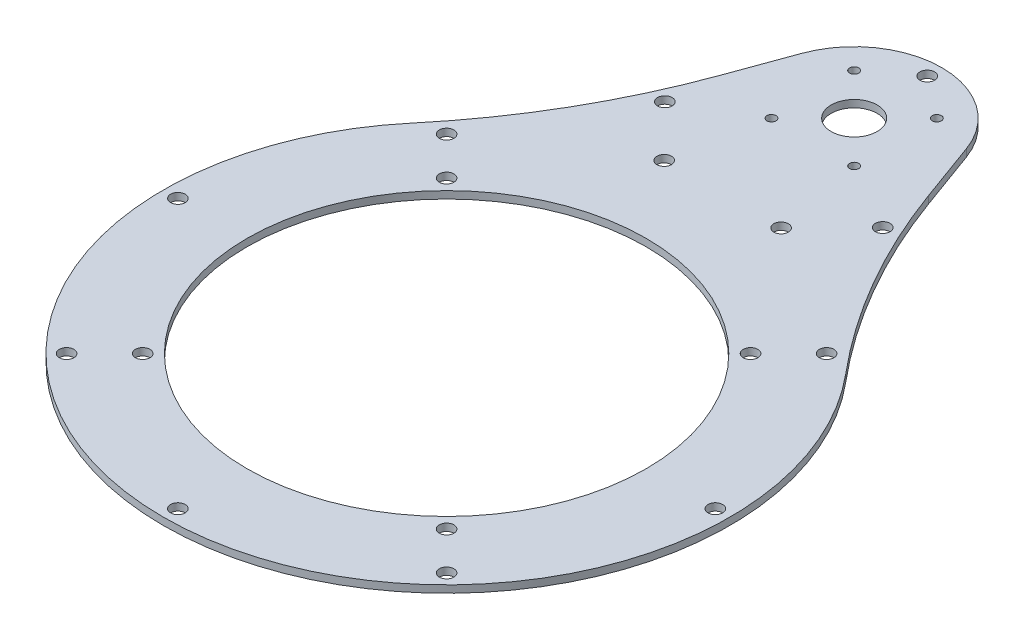
ISO-10303-21;
HEADER;
FILE_DESCRIPTION(('STEP AP214'),'2;1');
FILE_NAME('part.step','',(''),(''),'','','');
FILE_SCHEMA(('AUTOMOTIVE_DESIGN { 1 0 10303 214 1 1 1 1 }'));
ENDSEC;
DATA;
#1=APPLICATION_CONTEXT('core data for automotive mechanical design processes');
#2=APPLICATION_PROTOCOL_DEFINITION('international standard','automotive_design',2000,#1);
#3=PRODUCT_CONTEXT('',#1,'mechanical');
#4=PRODUCT('Part','Part','',(#3));
#5=PRODUCT_RELATED_PRODUCT_CATEGORY('part','',(#4));
#6=PRODUCT_DEFINITION_FORMATION('','',#4);
#7=PRODUCT_DEFINITION_CONTEXT('part definition',#1,'design');
#8=PRODUCT_DEFINITION('design','',#6,#7);
#9=PRODUCT_DEFINITION_SHAPE('','',#8);
#10=(LENGTH_UNIT() NAMED_UNIT(*) SI_UNIT(.MILLI.,.METRE.));
#11=(NAMED_UNIT(*) PLANE_ANGLE_UNIT() SI_UNIT($,.RADIAN.));
#12=(NAMED_UNIT(*) SI_UNIT($,.STERADIAN.) SOLID_ANGLE_UNIT());
#13=UNCERTAINTY_MEASURE_WITH_UNIT(LENGTH_MEASURE(1.E-05),#10,'distance_accuracy_value','');
#14=(GEOMETRIC_REPRESENTATION_CONTEXT(3) GLOBAL_UNCERTAINTY_ASSIGNED_CONTEXT((#13)) GLOBAL_UNIT_ASSIGNED_CONTEXT((#10,
#11,#12)) REPRESENTATION_CONTEXT('',''));
#15=CARTESIAN_POINT('',(0.,0.,0.));
#16=DIRECTION('',(0.,0.,1.));
#17=DIRECTION('',(1.,0.,0.));
#18=AXIS2_PLACEMENT_3D('',#15,#16,#17);
#19=CARTESIAN_POINT('',(310.404168796494,-67.975,-260.460023553028));
#20=DIRECTION('',(0.,1.,0.));
#21=DIRECTION('',(0.,0.,1.));
#22=AXIS2_PLACEMENT_3D('',#19,#20,#21);
#23=CYLINDRICAL_SURFACE('',#22,282.10386458607);
#24=CARTESIAN_POINT('',(310.404168796494,-64.8,-260.460023553028));
#25=DIRECTION('',(0.,-1.,0.));
#26=DIRECTION('',(0.,0.,-1.));
#27=AXIS2_PLACEMENT_3D('',#24,#25,#26);
#28=CIRCLE('',#27,282.10386458607);
#29=CARTESIAN_POINT('',(45.3132489497764,-64.8,-163.974819354577));
#30=VERTEX_POINT('',#29);
#31=CARTESIAN_POINT('',(94.3000709479463,-64.8,-79.1271547524128));
#32=VERTEX_POINT('',#31);
#33=EDGE_CURVE('E187',#30,#32,#28,.F.);
#34=ORIENTED_EDGE('',*,*,#33,.T.);
#35=DIRECTION('',(0.,1.,0.));
#36=VECTOR('',#35,1.);
#37=CARTESIAN_POINT('',(94.3000709479463,-67.975,-79.1271547524128));
#38=LINE('',#37,#36);
#39=CARTESIAN_POINT('',(94.3000709479463,-67.975,-79.1271547524128));
#40=VERTEX_POINT('',#39);
#41=EDGE_CURVE('E11',#40,#32,#38,.T.);
#42=ORIENTED_EDGE('',*,*,#41,.F.);
#43=CARTESIAN_POINT('',(310.404168796494,-67.975,-260.460023553028));
#44=DIRECTION('',(0.,-1.,0.));
#45=DIRECTION('',(0.,0.,-1.));
#46=AXIS2_PLACEMENT_3D('',#43,#44,#45);
#47=CIRCLE('',#46,282.10386458607);
#48=CARTESIAN_POINT('',(45.3132489497764,-67.975,-163.974819354577));
#49=VERTEX_POINT('',#48);
#50=EDGE_CURVE('E261',#49,#40,#47,.F.);
#51=ORIENTED_EDGE('',*,*,#50,.F.);
#52=DIRECTION('',(0.,1.,0.));
#53=VECTOR('',#52,1.);
#54=CARTESIAN_POINT('',(45.3132489497764,-67.975,-163.974819354577));
#55=LINE('',#54,#53);
#56=EDGE_CURVE('E168',#49,#30,#55,.T.);
#57=ORIENTED_EDGE('',*,*,#56,.T.);
#58=EDGE_LOOP('',(#34,#42,#51,#57));
#59=FACE_BOUND('',#58,.T.);
#60=ADVANCED_FACE('F35',(#59),#23,.F.);
#61=CARTESIAN_POINT('',(0.,-67.975,0.));
#62=DIRECTION('',(0.,1.,0.));
#63=DIRECTION('',(0.,0.,1.));
#64=AXIS2_PLACEMENT_3D('',#61,#62,#63);
#65=CYLINDRICAL_SURFACE('',#64,123.1);
#66=CARTESIAN_POINT('',(0.,-64.8,0.));
#67=DIRECTION('',(0.,-1.,0.));
#68=DIRECTION('',(0.,0.,-1.));
#69=AXIS2_PLACEMENT_3D('',#66,#67,#68);
#70=CIRCLE('',#69,123.1);
#71=CARTESIAN_POINT('',(-94.3000709479463,-64.8,-79.1271547524128));
#72=VERTEX_POINT('',#71);
#73=EDGE_CURVE('E190',#32,#72,#70,.T.);
#74=ORIENTED_EDGE('',*,*,#73,.T.);
#75=DIRECTION('',(0.,1.,0.));
#76=VECTOR('',#75,1.);
#77=CARTESIAN_POINT('',(-94.3000709479463,-67.975,-79.1271547524128));
#78=LINE('',#77,#76);
#79=CARTESIAN_POINT('',(-94.3000709479463,-67.975,-79.1271547524128));
#80=VERTEX_POINT('',#79);
#81=EDGE_CURVE('E44',#80,#72,#78,.T.);
#82=ORIENTED_EDGE('',*,*,#81,.F.);
#83=CARTESIAN_POINT('',(0.,-67.975,0.));
#84=DIRECTION('',(0.,-1.,0.));
#85=DIRECTION('',(0.,0.,-1.));
#86=AXIS2_PLACEMENT_3D('',#83,#84,#85);
#87=CIRCLE('',#86,123.1);
#88=EDGE_CURVE('E88',#40,#80,#87,.T.);
#89=ORIENTED_EDGE('',*,*,#88,.F.);
#90=ORIENTED_EDGE('',*,*,#41,.T.);
#91=EDGE_LOOP('',(#74,#82,#89,#90));
#92=FACE_BOUND('',#91,.T.);
#93=ADVANCED_FACE('F253',(#92),#65,.T.);
#94=CARTESIAN_POINT('',(-310.404168796494,-67.975,-260.460023553028));
#95=DIRECTION('',(0.,1.,0.));
#96=DIRECTION('',(0.,0.,1.));
#97=AXIS2_PLACEMENT_3D('',#94,#95,#96);
#98=CYLINDRICAL_SURFACE('',#97,282.10386458607);
#99=CARTESIAN_POINT('',(-310.404168796494,-64.8,-260.460023553028));
#100=DIRECTION('',(0.,-1.,0.));
#101=DIRECTION('',(0.,0.,-1.));
#102=AXIS2_PLACEMENT_3D('',#99,#100,#101);
#103=CIRCLE('',#102,282.10386458607);
#104=CARTESIAN_POINT('',(-45.3132489497764,-64.8,-163.974819354577));
#105=VERTEX_POINT('',#104);
#106=EDGE_CURVE('E193',#105,#72,#103,.T.);
#107=ORIENTED_EDGE('',*,*,#106,.F.);
#108=DIRECTION('',(0.,1.,0.));
#109=VECTOR('',#108,1.);
#110=CARTESIAN_POINT('',(-45.3132489497764,-67.975,-163.974819354577));
#111=LINE('',#110,#109);
#112=CARTESIAN_POINT('',(-45.3132489497764,-67.975,-163.974819354577));
#113=VERTEX_POINT('',#112);
#114=EDGE_CURVE('E104',#113,#105,#111,.T.);
#115=ORIENTED_EDGE('',*,*,#114,.F.);
#116=CARTESIAN_POINT('',(-310.404168796494,-67.975,-260.460023553028));
#117=DIRECTION('',(0.,-1.,0.));
#118=DIRECTION('',(0.,0.,-1.));
#119=AXIS2_PLACEMENT_3D('',#116,#117,#118);
#120=CIRCLE('',#119,282.10386458607);
#121=EDGE_CURVE('E114',#113,#80,#120,.T.);
#122=ORIENTED_EDGE('',*,*,#121,.T.);
#123=ORIENTED_EDGE('',*,*,#81,.T.);
#124=EDGE_LOOP('',(#107,#115,#122,#123));
#125=FACE_BOUND('',#124,.T.);
#126=ADVANCED_FACE('F252',(#125),#98,.F.);
#127=CARTESIAN_POINT('',(-92.713096844564,-67.975,-33.7448075780601));
#128=DIRECTION('',(-0.939692620785911,0.,-0.34202014332566));
#129=DIRECTION('',(-0.34202014332566,0.,0.939692620785912));
#130=AXIS2_PLACEMENT_3D('',#127,#128,#129);
#131=PLANE('',#130);
#132=DIRECTION('',(-0.34202014332566,0.,0.939692620785912));
#133=VECTOR('',#132,1.);
#134=CARTESIAN_POINT('',(-92.713096844564,-64.8,-33.7448075780601));
#135=LINE('',#134,#133);
#136=CARTESIAN_POINT('',(-35.8022888519432,-64.8,-190.105967460708));
#137=VERTEX_POINT('',#136);
#138=EDGE_CURVE('E103',#137,#105,#135,.T.);
#139=ORIENTED_EDGE('',*,*,#138,.F.);
#140=DIRECTION('',(0.,1.,0.));
#141=VECTOR('',#140,1.);
#142=CARTESIAN_POINT('',(-35.8022888519432,-67.975,-190.105967460708));
#143=LINE('',#142,#141);
#144=CARTESIAN_POINT('',(-35.8022888519432,-67.975,-190.105967460708));
#145=VERTEX_POINT('',#144);
#146=EDGE_CURVE('E97',#145,#137,#143,.T.);
#147=ORIENTED_EDGE('',*,*,#146,.F.);
#148=DIRECTION('',(-0.34202014332566,0.,0.939692620785912));
#149=VECTOR('',#148,1.);
#150=CARTESIAN_POINT('',(-92.713096844564,-67.975,-33.7448075780601));
#151=LINE('',#150,#149);
#152=EDGE_CURVE('E101',#145,#113,#151,.T.);
#153=ORIENTED_EDGE('',*,*,#152,.T.);
#154=ORIENTED_EDGE('',*,*,#114,.T.);
#155=EDGE_LOOP('',(#139,#147,#153,#154));
#156=FACE_BOUND('',#155,.T.);
#157=ADVANCED_FACE('F99',(#156),#131,.T.);
#158=CARTESIAN_POINT('',(0.,-67.975,-177.075));
#159=DIRECTION('',(0.,1.,0.));
#160=DIRECTION('',(0.,0.,1.));
#161=AXIS2_PLACEMENT_3D('',#158,#159,#160);
#162=CYLINDRICAL_SURFACE('',#161,38.1);
#163=CARTESIAN_POINT('',(0.,-64.8,-177.075));
#164=DIRECTION('',(0.,-1.,0.));
#165=DIRECTION('',(0.,0.,-1.));
#166=AXIS2_PLACEMENT_3D('',#163,#164,#165);
#167=CIRCLE('',#166,38.1);
#168=CARTESIAN_POINT('',(35.8022888519432,-64.8,-190.105967460708));
#169=VERTEX_POINT('',#168);
#170=EDGE_CURVE('E74',#137,#169,#167,.T.);
#171=ORIENTED_EDGE('',*,*,#170,.T.);
#172=DIRECTION('',(0.,1.,0.));
#173=VECTOR('',#172,1.);
#174=CARTESIAN_POINT('',(35.8022888519432,-67.975,-190.105967460708));
#175=LINE('',#174,#173);
#176=CARTESIAN_POINT('',(35.8022888519432,-67.975,-190.105967460708));
#177=VERTEX_POINT('',#176);
#178=EDGE_CURVE('E105',#177,#169,#175,.T.);
#179=ORIENTED_EDGE('',*,*,#178,.F.);
#180=CARTESIAN_POINT('',(0.,-67.975,-177.075));
#181=DIRECTION('',(0.,-1.,0.));
#182=DIRECTION('',(0.,0.,-1.));
#183=AXIS2_PLACEMENT_3D('',#180,#181,#182);
#184=CIRCLE('',#183,38.1);
#185=EDGE_CURVE('E107',#145,#177,#184,.T.);
#186=ORIENTED_EDGE('',*,*,#185,.F.);
#187=ORIENTED_EDGE('',*,*,#146,.T.);
#188=EDGE_LOOP('',(#171,#179,#186,#187));
#189=FACE_BOUND('',#188,.T.);
#190=ADVANCED_FACE('F108',(#189),#162,.T.);
#191=CARTESIAN_POINT('',(0.,-67.975,0.));
#192=DIRECTION('',(0.,1.,0.));
#193=DIRECTION('',(0.,0.,1.));
#194=AXIS2_PLACEMENT_3D('',#191,#192,#193);
#195=CYLINDRICAL_SURFACE('',#194,86.7075);
#196=CARTESIAN_POINT('',(0.,-67.975,0.));
#197=DIRECTION('',(0.,-1.,0.));
#198=DIRECTION('',(0.,0.,-1.));
#199=AXIS2_PLACEMENT_3D('',#196,#197,#198);
#200=CIRCLE('',#199,86.7075);
#201=CARTESIAN_POINT('',(0.,-67.975,-86.7075));
#202=VERTEX_POINT('',#201);
#203=EDGE_CURVE('E162',#202,#202,#200,.F.);
#204=ORIENTED_EDGE('',*,*,#203,.F.);
#205=EDGE_LOOP('',(#204));
#206=FACE_BOUND('',#205,.T.);
#207=CARTESIAN_POINT('',(0.,-64.8,0.));
#208=DIRECTION('',(0.,-1.,0.));
#209=DIRECTION('',(0.,0.,-1.));
#210=AXIS2_PLACEMENT_3D('',#207,#208,#209);
#211=CIRCLE('',#210,86.7075);
#212=CARTESIAN_POINT('',(0.,-64.8,-86.7075));
#213=VERTEX_POINT('',#212);
#214=EDGE_CURVE('E241',#213,#213,#211,.F.);
#215=ORIENTED_EDGE('',*,*,#214,.T.);
#216=EDGE_LOOP('',(#215));
#217=FACE_BOUND('',#216,.T.);
#218=ADVANCED_FACE('F335',(#206,#217),#195,.F.);
#219=CARTESIAN_POINT('',(66.0260956932935,-67.975,-66.0260956932942));
#220=DIRECTION('',(0.,1.,0.));
#221=DIRECTION('',(0.,0.,1.));
#222=AXIS2_PLACEMENT_3D('',#219,#220,#221);
#223=CYLINDRICAL_SURFACE('',#222,3.175);
#224=CARTESIAN_POINT('',(66.0260956932935,-67.975,-66.0260956932942));
#225=DIRECTION('',(0.,-1.,0.));
#226=DIRECTION('',(0.,0.,-1.));
#227=AXIS2_PLACEMENT_3D('',#224,#225,#226);
#228=CIRCLE('',#227,3.175);
#229=CARTESIAN_POINT('',(66.0260956932935,-67.975,-69.2010956932942));
#230=VERTEX_POINT('',#229);
#231=EDGE_CURVE('E159',#230,#230,#228,.F.);
#232=ORIENTED_EDGE('',*,*,#231,.F.);
#233=EDGE_LOOP('',(#232));
#234=FACE_BOUND('',#233,.T.);
#235=CARTESIAN_POINT('',(66.0260956932935,-64.8,-66.0260956932942));
#236=DIRECTION('',(0.,-1.,0.));
#237=DIRECTION('',(0.,0.,-1.));
#238=AXIS2_PLACEMENT_3D('',#235,#236,#237);
#239=CIRCLE('',#238,3.175);
#240=CARTESIAN_POINT('',(66.0260956932935,-64.8,-69.2010956932942));
#241=VERTEX_POINT('',#240);
#242=EDGE_CURVE('E238',#241,#241,#239,.F.);
#243=ORIENTED_EDGE('',*,*,#242,.T.);
#244=EDGE_LOOP('',(#243));
#245=FACE_BOUND('',#244,.T.);
#246=ADVANCED_FACE('F338',(#234,#245),#223,.F.);
#247=CARTESIAN_POINT('',(-66.0260956932935,-67.975,66.0260956932942));
#248=DIRECTION('',(0.,1.,0.));
#249=DIRECTION('',(0.,0.,1.));
#250=AXIS2_PLACEMENT_3D('',#247,#248,#249);
#251=CYLINDRICAL_SURFACE('',#250,3.175);
#252=CARTESIAN_POINT('',(-66.0260956932935,-67.975,66.0260956932942));
#253=DIRECTION('',(0.,-1.,0.));
#254=DIRECTION('',(0.,0.,-1.));
#255=AXIS2_PLACEMENT_3D('',#252,#253,#254);
#256=CIRCLE('',#255,3.175);
#257=CARTESIAN_POINT('',(-66.0260956932935,-67.975,62.8510956932942));
#258=VERTEX_POINT('',#257);
#259=EDGE_CURVE('E156',#258,#258,#256,.F.);
#260=ORIENTED_EDGE('',*,*,#259,.F.);
#261=EDGE_LOOP('',(#260));
#262=FACE_BOUND('',#261,.T.);
#263=CARTESIAN_POINT('',(-66.0260956932935,-64.8,66.0260956932942));
#264=DIRECTION('',(0.,-1.,0.));
#265=DIRECTION('',(0.,0.,-1.));
#266=AXIS2_PLACEMENT_3D('',#263,#264,#265);
#267=CIRCLE('',#266,3.175);
#268=CARTESIAN_POINT('',(-66.0260956932935,-64.8,62.8510956932942));
#269=VERTEX_POINT('',#268);
#270=EDGE_CURVE('E235',#269,#269,#267,.F.);
#271=ORIENTED_EDGE('',*,*,#270,.T.);
#272=EDGE_LOOP('',(#271));
#273=FACE_BOUND('',#272,.T.);
#274=ADVANCED_FACE('F342',(#262,#273),#251,.F.);
#275=CARTESIAN_POINT('',(66.0260956932942,-67.975,66.0260956932935));
#276=DIRECTION('',(0.,1.,0.));
#277=DIRECTION('',(0.,0.,1.));
#278=AXIS2_PLACEMENT_3D('',#275,#276,#277);
#279=CYLINDRICAL_SURFACE('',#278,3.175);
#280=CARTESIAN_POINT('',(66.0260956932942,-67.975,66.0260956932935));
#281=DIRECTION('',(0.,-1.,0.));
#282=DIRECTION('',(0.,0.,-1.));
#283=AXIS2_PLACEMENT_3D('',#280,#281,#282);
#284=CIRCLE('',#283,3.175);
#285=CARTESIAN_POINT('',(66.0260956932942,-67.975,62.8510956932935));
#286=VERTEX_POINT('',#285);
#287=EDGE_CURVE('E153',#286,#286,#284,.F.);
#288=ORIENTED_EDGE('',*,*,#287,.F.);
#289=EDGE_LOOP('',(#288));
#290=FACE_BOUND('',#289,.T.);
#291=CARTESIAN_POINT('',(66.0260956932942,-64.8,66.0260956932935));
#292=DIRECTION('',(0.,-1.,0.));
#293=DIRECTION('',(0.,0.,-1.));
#294=AXIS2_PLACEMENT_3D('',#291,#292,#293);
#295=CIRCLE('',#294,3.175);
#296=CARTESIAN_POINT('',(66.0260956932942,-64.8,62.8510956932935));
#297=VERTEX_POINT('',#296);
#298=EDGE_CURVE('E232',#297,#297,#295,.F.);
#299=ORIENTED_EDGE('',*,*,#298,.T.);
#300=EDGE_LOOP('',(#299));
#301=FACE_BOUND('',#300,.T.);
#302=ADVANCED_FACE('F346',(#290,#301),#279,.F.);
#303=CARTESIAN_POINT('',(47.3293309242248,-67.975,-142.15));
#304=DIRECTION('',(0.,1.,0.));
#305=DIRECTION('',(0.,0.,1.));
#306=AXIS2_PLACEMENT_3D('',#303,#304,#305);
#307=CYLINDRICAL_SURFACE('',#306,3.175);
#308=CARTESIAN_POINT('',(47.3293309242248,-67.975,-142.15));
#309=DIRECTION('',(0.,-1.,0.));
#310=DIRECTION('',(0.,0.,-1.));
#311=AXIS2_PLACEMENT_3D('',#308,#309,#310);
#312=CIRCLE('',#311,3.175);
#313=CARTESIAN_POINT('',(47.3293309242248,-67.975,-145.325));
#314=VERTEX_POINT('',#313);
#315=EDGE_CURVE('E150',#314,#314,#312,.F.);
#316=ORIENTED_EDGE('',*,*,#315,.F.);
#317=EDGE_LOOP('',(#316));
#318=FACE_BOUND('',#317,.T.);
#319=CARTESIAN_POINT('',(47.3293309242248,-64.8,-142.15));
#320=DIRECTION('',(0.,-1.,0.));
#321=DIRECTION('',(0.,0.,-1.));
#322=AXIS2_PLACEMENT_3D('',#319,#320,#321);
#323=CIRCLE('',#322,3.175);
#324=CARTESIAN_POINT('',(47.3293309242248,-64.8,-145.325));
#325=VERTEX_POINT('',#324);
#326=EDGE_CURVE('E229',#325,#325,#323,.F.);
#327=ORIENTED_EDGE('',*,*,#326,.T.);
#328=EDGE_LOOP('',(#327));
#329=FACE_BOUND('',#328,.T.);
#330=ADVANCED_FACE('F350',(#318,#329),#307,.F.);
#331=CARTESIAN_POINT('',(-47.3293309242248,-67.975,-142.15));
#332=DIRECTION('',(0.,1.,0.));
#333=DIRECTION('',(0.,0.,1.));
#334=AXIS2_PLACEMENT_3D('',#331,#332,#333);
#335=CYLINDRICAL_SURFACE('',#334,3.175);
#336=CARTESIAN_POINT('',(-47.3293309242248,-67.975,-142.15));
#337=DIRECTION('',(0.,-1.,0.));
#338=DIRECTION('',(0.,0.,-1.));
#339=AXIS2_PLACEMENT_3D('',#336,#337,#338);
#340=CIRCLE('',#339,3.175);
#341=CARTESIAN_POINT('',(-47.3293309242248,-67.975,-145.325));
#342=VERTEX_POINT('',#341);
#343=EDGE_CURVE('E147',#342,#342,#340,.T.);
#344=ORIENTED_EDGE('',*,*,#343,.T.);
#345=EDGE_LOOP('',(#344));
#346=FACE_BOUND('',#345,.T.);
#347=CARTESIAN_POINT('',(-47.3293309242248,-64.8,-142.15));
#348=DIRECTION('',(0.,-1.,0.));
#349=DIRECTION('',(0.,0.,-1.));
#350=AXIS2_PLACEMENT_3D('',#347,#348,#349);
#351=CIRCLE('',#350,3.175);
#352=CARTESIAN_POINT('',(-47.3293309242248,-64.8,-145.325));
#353=VERTEX_POINT('',#352);
#354=EDGE_CURVE('E226',#353,#353,#351,.T.);
#355=ORIENTED_EDGE('',*,*,#354,.F.);
#356=EDGE_LOOP('',(#355));
#357=FACE_BOUND('',#356,.T.);
#358=ADVANCED_FACE('F354',(#346,#357),#335,.F.);
#359=CARTESIAN_POINT('',(0.,-67.975,-208.825));
#360=DIRECTION('',(0.,1.,0.));
#361=DIRECTION('',(0.,0.,1.));
#362=AXIS2_PLACEMENT_3D('',#359,#360,#361);
#363=CYLINDRICAL_SURFACE('',#362,3.175);
#364=CARTESIAN_POINT('',(0.,-67.975,-208.825));
#365=DIRECTION('',(0.,-1.,0.));
#366=DIRECTION('',(0.,0.,-1.));
#367=AXIS2_PLACEMENT_3D('',#364,#365,#366);
#368=CIRCLE('',#367,3.175);
#369=CARTESIAN_POINT('',(0.,-67.975,-212.));
#370=VERTEX_POINT('',#369);
#371=EDGE_CURVE('E144',#370,#370,#368,.T.);
#372=ORIENTED_EDGE('',*,*,#371,.T.);
#373=EDGE_LOOP('',(#372));
#374=FACE_BOUND('',#373,.T.);
#375=CARTESIAN_POINT('',(0.,-64.8,-208.825));
#376=DIRECTION('',(0.,-1.,0.));
#377=DIRECTION('',(0.,0.,-1.));
#378=AXIS2_PLACEMENT_3D('',#375,#376,#377);
#379=CIRCLE('',#378,3.175);
#380=CARTESIAN_POINT('',(0.,-64.8,-212.));
#381=VERTEX_POINT('',#380);
#382=EDGE_CURVE('E223',#381,#381,#379,.T.);
#383=ORIENTED_EDGE('',*,*,#382,.F.);
#384=EDGE_LOOP('',(#383));
#385=FACE_BOUND('',#384,.T.);
#386=ADVANCED_FACE('F358',(#374,#385),#363,.F.);
#387=CARTESIAN_POINT('',(-82.5547167035295,-67.975,82.5547167035294));
#388=DIRECTION('',(0.,1.,0.));
#389=DIRECTION('',(0.,0.,1.));
#390=AXIS2_PLACEMENT_3D('',#387,#388,#389);
#391=CYLINDRICAL_SURFACE('',#390,3.175);
#392=CARTESIAN_POINT('',(-82.5547167035295,-67.975,82.5547167035294));
#393=DIRECTION('',(0.,-1.,0.));
#394=DIRECTION('',(0.,0.,-1.));
#395=AXIS2_PLACEMENT_3D('',#392,#393,#394);
#396=CIRCLE('',#395,3.175);
#397=CARTESIAN_POINT('',(-82.5547167035295,-67.975,79.3797167035294));
#398=VERTEX_POINT('',#397);
#399=EDGE_CURVE('E141',#398,#398,#396,.T.);
#400=ORIENTED_EDGE('',*,*,#399,.T.);
#401=EDGE_LOOP('',(#400));
#402=FACE_BOUND('',#401,.T.);
#403=CARTESIAN_POINT('',(-82.5547167035295,-64.8,82.5547167035294));
#404=DIRECTION('',(0.,-1.,0.));
#405=DIRECTION('',(0.,0.,-1.));
#406=AXIS2_PLACEMENT_3D('',#403,#404,#405);
#407=CIRCLE('',#406,3.175);
#408=CARTESIAN_POINT('',(-82.5547167035295,-64.8,79.3797167035294));
#409=VERTEX_POINT('',#408);
#410=EDGE_CURVE('E220',#409,#409,#407,.T.);
#411=ORIENTED_EDGE('',*,*,#410,.F.);
#412=EDGE_LOOP('',(#411));
#413=FACE_BOUND('',#412,.T.);
#414=ADVANCED_FACE('F362',(#402,#413),#391,.F.);
#415=CARTESIAN_POINT('',(-116.75,-67.975,0.));
#416=DIRECTION('',(0.,1.,0.));
#417=DIRECTION('',(0.,0.,1.));
#418=AXIS2_PLACEMENT_3D('',#415,#416,#417);
#419=CYLINDRICAL_SURFACE('',#418,3.175);
#420=CARTESIAN_POINT('',(-116.75,-67.975,0.));
#421=DIRECTION('',(0.,-1.,0.));
#422=DIRECTION('',(0.,0.,-1.));
#423=AXIS2_PLACEMENT_3D('',#420,#421,#422);
#424=CIRCLE('',#423,3.175);
#425=CARTESIAN_POINT('',(-116.75,-67.975,-3.17500000000003));
#426=VERTEX_POINT('',#425);
#427=EDGE_CURVE('E138',#426,#426,#424,.T.);
#428=ORIENTED_EDGE('',*,*,#427,.T.);
#429=EDGE_LOOP('',(#428));
#430=FACE_BOUND('',#429,.T.);
#431=CARTESIAN_POINT('',(-116.75,-64.8,0.));
#432=DIRECTION('',(0.,-1.,0.));
#433=DIRECTION('',(0.,0.,-1.));
#434=AXIS2_PLACEMENT_3D('',#431,#432,#433);
#435=CIRCLE('',#434,3.175);
#436=CARTESIAN_POINT('',(-116.75,-64.8,-3.17500000000003));
#437=VERTEX_POINT('',#436);
#438=EDGE_CURVE('E217',#437,#437,#435,.T.);
#439=ORIENTED_EDGE('',*,*,#438,.F.);
#440=EDGE_LOOP('',(#439));
#441=FACE_BOUND('',#440,.T.);
#442=ADVANCED_FACE('F366',(#430,#441),#419,.F.);
#443=CARTESIAN_POINT('',(-82.5547167035294,-67.975,-82.5547167035295));
#444=DIRECTION('',(0.,1.,0.));
#445=DIRECTION('',(0.,0.,1.));
#446=AXIS2_PLACEMENT_3D('',#443,#444,#445);
#447=CYLINDRICAL_SURFACE('',#446,3.17500000000001);
#448=CARTESIAN_POINT('',(-82.5547167035294,-67.975,-82.5547167035295));
#449=DIRECTION('',(0.,-1.,0.));
#450=DIRECTION('',(0.,0.,-1.));
#451=AXIS2_PLACEMENT_3D('',#448,#449,#450);
#452=CIRCLE('',#451,3.17500000000001);
#453=CARTESIAN_POINT('',(-82.5547167035294,-67.975,-85.7297167035295));
#454=VERTEX_POINT('',#453);
#455=EDGE_CURVE('E135',#454,#454,#452,.T.);
#456=ORIENTED_EDGE('',*,*,#455,.T.);
#457=EDGE_LOOP('',(#456));
#458=FACE_BOUND('',#457,.T.);
#459=CARTESIAN_POINT('',(-82.5547167035294,-64.8,-82.5547167035295));
#460=DIRECTION('',(0.,-1.,0.));
#461=DIRECTION('',(0.,0.,-1.));
#462=AXIS2_PLACEMENT_3D('',#459,#460,#461);
#463=CIRCLE('',#462,3.17500000000001);
#464=CARTESIAN_POINT('',(-82.5547167035294,-64.8,-85.7297167035295));
#465=VERTEX_POINT('',#464);
#466=EDGE_CURVE('E214',#465,#465,#463,.T.);
#467=ORIENTED_EDGE('',*,*,#466,.F.);
#468=EDGE_LOOP('',(#467));
#469=FACE_BOUND('',#468,.T.);
#470=ADVANCED_FACE('F370',(#458,#469),#447,.F.);
#471=CARTESIAN_POINT('',(82.5547167035294,-67.975,-82.5547167035294));
#472=DIRECTION('',(0.,1.,0.));
#473=DIRECTION('',(0.,0.,1.));
#474=AXIS2_PLACEMENT_3D('',#471,#472,#473);
#475=CYLINDRICAL_SURFACE('',#474,3.175);
#476=CARTESIAN_POINT('',(82.5547167035294,-67.975,-82.5547167035294));
#477=DIRECTION('',(0.,-1.,0.));
#478=DIRECTION('',(0.,0.,-1.));
#479=AXIS2_PLACEMENT_3D('',#476,#477,#478);
#480=CIRCLE('',#479,3.175);
#481=CARTESIAN_POINT('',(82.5547167035294,-67.975,-85.7297167035294));
#482=VERTEX_POINT('',#481);
#483=EDGE_CURVE('E132',#482,#482,#480,.T.);
#484=ORIENTED_EDGE('',*,*,#483,.T.);
#485=EDGE_LOOP('',(#484));
#486=FACE_BOUND('',#485,.T.);
#487=CARTESIAN_POINT('',(82.5547167035294,-64.8,-82.5547167035294));
#488=DIRECTION('',(0.,-1.,0.));
#489=DIRECTION('',(0.,0.,-1.));
#490=AXIS2_PLACEMENT_3D('',#487,#488,#489);
#491=CIRCLE('',#490,3.175);
#492=CARTESIAN_POINT('',(82.5547167035294,-64.8,-85.7297167035294));
#493=VERTEX_POINT('',#492);
#494=EDGE_CURVE('E211',#493,#493,#491,.T.);
#495=ORIENTED_EDGE('',*,*,#494,.F.);
#496=EDGE_LOOP('',(#495));
#497=FACE_BOUND('',#496,.T.);
#498=ADVANCED_FACE('F374',(#486,#497),#475,.F.);
#499=CARTESIAN_POINT('',(116.75,-67.975,0.));
#500=DIRECTION('',(0.,1.,0.));
#501=DIRECTION('',(0.,0.,1.));
#502=AXIS2_PLACEMENT_3D('',#499,#500,#501);
#503=CYLINDRICAL_SURFACE('',#502,3.175);
#504=CARTESIAN_POINT('',(116.75,-67.975,0.));
#505=DIRECTION('',(0.,-1.,0.));
#506=DIRECTION('',(0.,0.,-1.));
#507=AXIS2_PLACEMENT_3D('',#504,#505,#506);
#508=CIRCLE('',#507,3.175);
#509=CARTESIAN_POINT('',(116.75,-67.975,-3.17499999999998));
#510=VERTEX_POINT('',#509);
#511=EDGE_CURVE('E129',#510,#510,#508,.T.);
#512=ORIENTED_EDGE('',*,*,#511,.T.);
#513=EDGE_LOOP('',(#512));
#514=FACE_BOUND('',#513,.T.);
#515=CARTESIAN_POINT('',(116.75,-64.8,0.));
#516=DIRECTION('',(0.,-1.,0.));
#517=DIRECTION('',(0.,0.,-1.));
#518=AXIS2_PLACEMENT_3D('',#515,#516,#517);
#519=CIRCLE('',#518,3.175);
#520=CARTESIAN_POINT('',(116.75,-64.8,-3.17499999999998));
#521=VERTEX_POINT('',#520);
#522=EDGE_CURVE('E208',#521,#521,#519,.T.);
#523=ORIENTED_EDGE('',*,*,#522,.F.);
#524=EDGE_LOOP('',(#523));
#525=FACE_BOUND('',#524,.T.);
#526=ADVANCED_FACE('F378',(#514,#525),#503,.F.);
#527=CARTESIAN_POINT('',(82.5547167035294,-67.975,82.5547167035294));
#528=DIRECTION('',(0.,1.,0.));
#529=DIRECTION('',(0.,0.,1.));
#530=AXIS2_PLACEMENT_3D('',#527,#528,#529);
#531=CYLINDRICAL_SURFACE('',#530,3.17500000000001);
#532=CARTESIAN_POINT('',(82.5547167035294,-67.975,82.5547167035294));
#533=DIRECTION('',(0.,-1.,0.));
#534=DIRECTION('',(0.,0.,-1.));
#535=AXIS2_PLACEMENT_3D('',#532,#533,#534);
#536=CIRCLE('',#535,3.17500000000001);
#537=CARTESIAN_POINT('',(82.5547167035294,-67.975,79.3797167035294));
#538=VERTEX_POINT('',#537);
#539=EDGE_CURVE('E126',#538,#538,#536,.T.);
#540=ORIENTED_EDGE('',*,*,#539,.T.);
#541=EDGE_LOOP('',(#540));
#542=FACE_BOUND('',#541,.T.);
#543=CARTESIAN_POINT('',(82.5547167035294,-64.8,82.5547167035294));
#544=DIRECTION('',(0.,-1.,0.));
#545=DIRECTION('',(0.,0.,-1.));
#546=AXIS2_PLACEMENT_3D('',#543,#544,#545);
#547=CIRCLE('',#546,3.17500000000001);
#548=CARTESIAN_POINT('',(82.5547167035294,-64.8,79.3797167035294));
#549=VERTEX_POINT('',#548);
#550=EDGE_CURVE('E205',#549,#549,#547,.T.);
#551=ORIENTED_EDGE('',*,*,#550,.F.);
#552=EDGE_LOOP('',(#551));
#553=FACE_BOUND('',#552,.T.);
#554=ADVANCED_FACE('F382',(#542,#553),#531,.F.);
#555=CARTESIAN_POINT('',(0.,-67.975,116.75));
#556=DIRECTION('',(0.,1.,0.));
#557=DIRECTION('',(0.,0.,1.));
#558=AXIS2_PLACEMENT_3D('',#555,#556,#557);
#559=CYLINDRICAL_SURFACE('',#558,3.175);
#560=CARTESIAN_POINT('',(0.,-67.975,116.75));
#561=DIRECTION('',(0.,-1.,0.));
#562=DIRECTION('',(0.,0.,-1.));
#563=AXIS2_PLACEMENT_3D('',#560,#561,#562);
#564=CIRCLE('',#563,3.175);
#565=CARTESIAN_POINT('',(0.,-67.975,113.575));
#566=VERTEX_POINT('',#565);
#567=EDGE_CURVE('E123',#566,#566,#564,.T.);
#568=ORIENTED_EDGE('',*,*,#567,.T.);
#569=EDGE_LOOP('',(#568));
#570=FACE_BOUND('',#569,.T.);
#571=CARTESIAN_POINT('',(0.,-64.8,116.75));
#572=DIRECTION('',(0.,-1.,0.));
#573=DIRECTION('',(0.,0.,-1.));
#574=AXIS2_PLACEMENT_3D('',#571,#572,#573);
#575=CIRCLE('',#574,3.175);
#576=CARTESIAN_POINT('',(0.,-64.8,113.575));
#577=VERTEX_POINT('',#576);
#578=EDGE_CURVE('E202',#577,#577,#575,.T.);
#579=ORIENTED_EDGE('',*,*,#578,.F.);
#580=EDGE_LOOP('',(#579));
#581=FACE_BOUND('',#580,.T.);
#582=ADVANCED_FACE('F274',(#570,#581),#559,.F.);
#583=CARTESIAN_POINT('',(-17.9605122421382,-67.975,-195.035512242138));
#584=DIRECTION('',(0.,1.,0.));
#585=DIRECTION('',(0.,0.,1.));
#586=AXIS2_PLACEMENT_3D('',#583,#584,#585);
#587=CYLINDRICAL_SURFACE('',#586,1.98437499999999);
#588=CARTESIAN_POINT('',(-17.9605122421382,-67.975,-195.035512242138));
#589=DIRECTION('',(0.,-1.,0.));
#590=DIRECTION('',(0.,0.,-1.));
#591=AXIS2_PLACEMENT_3D('',#588,#589,#590);
#592=CIRCLE('',#591,1.98437499999999);
#593=CARTESIAN_POINT('',(-17.9605122421382,-67.975,-197.019887242138));
#594=VERTEX_POINT('',#593);
#595=EDGE_CURVE('E120',#594,#594,#592,.F.);
#596=ORIENTED_EDGE('',*,*,#595,.F.);
#597=EDGE_LOOP('',(#596));
#598=FACE_BOUND('',#597,.T.);
#599=CARTESIAN_POINT('',(-17.9605122421382,-64.8,-195.035512242138));
#600=DIRECTION('',(0.,-1.,0.));
#601=DIRECTION('',(0.,0.,-1.));
#602=AXIS2_PLACEMENT_3D('',#599,#600,#601);
#603=CIRCLE('',#602,1.98437499999999);
#604=CARTESIAN_POINT('',(-17.9605122421382,-64.8,-197.019887242138));
#605=VERTEX_POINT('',#604);
#606=EDGE_CURVE('E199',#605,#605,#603,.F.);
#607=ORIENTED_EDGE('',*,*,#606,.T.);
#608=EDGE_LOOP('',(#607));
#609=FACE_BOUND('',#608,.T.);
#610=ADVANCED_FACE('F265',(#598,#609),#587,.F.);
#611=CARTESIAN_POINT('',(92.713096844564,-67.975,-33.7448075780601));
#612=DIRECTION('',(-0.939692620785911,0.,0.34202014332566));
#613=DIRECTION('',(0.34202014332566,0.,0.939692620785912));
#614=AXIS2_PLACEMENT_3D('',#611,#612,#613);
#615=PLANE('',#614);
#616=DIRECTION('',(0.34202014332566,0.,0.939692620785912));
#617=VECTOR('',#616,1.);
#618=CARTESIAN_POINT('',(92.713096844564,-64.8,-33.7448075780601));
#619=LINE('',#618,#617);
#620=EDGE_CURVE('E80',#169,#30,#619,.T.);
#621=ORIENTED_EDGE('',*,*,#620,.T.);
#622=ORIENTED_EDGE('',*,*,#56,.F.);
#623=DIRECTION('',(0.34202014332566,0.,0.939692620785912));
#624=VECTOR('',#623,1.);
#625=CARTESIAN_POINT('',(92.713096844564,-67.975,-33.7448075780601));
#626=LINE('',#625,#624);
#627=EDGE_CURVE('E52',#177,#49,#626,.T.);
#628=ORIENTED_EDGE('',*,*,#627,.F.);
#629=ORIENTED_EDGE('',*,*,#178,.T.);
#630=EDGE_LOOP('',(#621,#622,#628,#629));
#631=FACE_BOUND('',#630,.T.);
#632=ADVANCED_FACE('F262',(#631),#615,.F.);
#633=CARTESIAN_POINT('',(0.,-67.975,-177.075));
#634=DIRECTION('',(0.,1.,0.));
#635=DIRECTION('',(0.,0.,1.));
#636=AXIS2_PLACEMENT_3D('',#633,#634,#635);
#637=CYLINDRICAL_SURFACE('',#636,10.0000054);
#638=CARTESIAN_POINT('',(0.,-67.975,-177.075));
#639=DIRECTION('',(0.,-1.,0.));
#640=DIRECTION('',(0.,0.,-1.));
#641=AXIS2_PLACEMENT_3D('',#638,#639,#640);
#642=CIRCLE('',#641,10.0000054);
#643=CARTESIAN_POINT('',(0.,-67.975,-187.0750054));
#644=VERTEX_POINT('',#643);
#645=EDGE_CURVE('E680',#644,#644,#642,.T.);
#646=ORIENTED_EDGE('',*,*,#645,.T.);
#647=EDGE_LOOP('',(#646));
#648=FACE_BOUND('',#647,.T.);
#649=CARTESIAN_POINT('',(0.,-64.8,-177.075));
#650=DIRECTION('',(0.,-1.,0.));
#651=DIRECTION('',(0.,0.,-1.));
#652=AXIS2_PLACEMENT_3D('',#649,#650,#651);
#653=CIRCLE('',#652,10.0000054);
#654=CARTESIAN_POINT('',(0.,-64.8,-187.0750054));
#655=VERTEX_POINT('',#654);
#656=EDGE_CURVE('E184',#655,#655,#653,.T.);
#657=ORIENTED_EDGE('',*,*,#656,.F.);
#658=EDGE_LOOP('',(#657));
#659=FACE_BOUND('',#658,.T.);
#660=ADVANCED_FACE('F264',(#648,#659),#637,.F.);
#661=CARTESIAN_POINT('',(-17.9605122421382,-67.975,-159.114487757862));
#662=DIRECTION('',(0.,1.,0.));
#663=DIRECTION('',(0.,0.,1.));
#664=AXIS2_PLACEMENT_3D('',#661,#662,#663);
#665=CYLINDRICAL_SURFACE('',#664,1.98437499999997);
#666=CARTESIAN_POINT('',(-17.9605122421382,-67.975,-159.114487757862));
#667=DIRECTION('',(0.,-1.,0.));
#668=DIRECTION('',(0.,0.,-1.));
#669=AXIS2_PLACEMENT_3D('',#666,#667,#668);
#670=CIRCLE('',#669,1.98437499999997);
#671=CARTESIAN_POINT('',(-17.9605122421382,-67.975,-161.098862757862));
#672=VERTEX_POINT('',#671);
#673=EDGE_CURVE('E677',#672,#672,#670,.T.);
#674=ORIENTED_EDGE('',*,*,#673,.T.);
#675=EDGE_LOOP('',(#674));
#676=FACE_BOUND('',#675,.T.);
#677=CARTESIAN_POINT('',(-17.9605122421382,-64.8,-159.114487757862));
#678=DIRECTION('',(0.,-1.,0.));
#679=DIRECTION('',(0.,0.,-1.));
#680=AXIS2_PLACEMENT_3D('',#677,#678,#679);
#681=CIRCLE('',#680,1.98437499999997);
#682=CARTESIAN_POINT('',(-17.9605122421382,-64.8,-161.098862757862));
#683=VERTEX_POINT('',#682);
#684=EDGE_CURVE('E181',#683,#683,#681,.T.);
#685=ORIENTED_EDGE('',*,*,#684,.F.);
#686=EDGE_LOOP('',(#685));
#687=FACE_BOUND('',#686,.T.);
#688=ADVANCED_FACE('F271',(#676,#687),#665,.F.);
#689=CARTESIAN_POINT('',(17.9605122421382,-67.975,-159.114487757862));
#690=DIRECTION('',(0.,1.,0.));
#691=DIRECTION('',(0.,0.,1.));
#692=AXIS2_PLACEMENT_3D('',#689,#690,#691);
#693=CYLINDRICAL_SURFACE('',#692,1.98437500000001);
#694=CARTESIAN_POINT('',(17.9605122421382,-67.975,-159.114487757862));
#695=DIRECTION('',(0.,-1.,0.));
#696=DIRECTION('',(0.,0.,-1.));
#697=AXIS2_PLACEMENT_3D('',#694,#695,#696);
#698=CIRCLE('',#697,1.98437500000001);
#699=CARTESIAN_POINT('',(17.9605122421382,-67.975,-161.098862757862));
#700=VERTEX_POINT('',#699);
#701=EDGE_CURVE('E673',#700,#700,#698,.F.);
#702=ORIENTED_EDGE('',*,*,#701,.F.);
#703=EDGE_LOOP('',(#702));
#704=FACE_BOUND('',#703,.T.);
#705=CARTESIAN_POINT('',(17.9605122421382,-64.8,-159.114487757862));
#706=DIRECTION('',(0.,-1.,0.));
#707=DIRECTION('',(0.,0.,-1.));
#708=AXIS2_PLACEMENT_3D('',#705,#706,#707);
#709=CIRCLE('',#708,1.98437500000001);
#710=CARTESIAN_POINT('',(17.9605122421382,-64.8,-161.098862757862));
#711=VERTEX_POINT('',#710);
#712=EDGE_CURVE('E178',#711,#711,#709,.F.);
#713=ORIENTED_EDGE('',*,*,#712,.T.);
#714=EDGE_LOOP('',(#713));
#715=FACE_BOUND('',#714,.T.);
#716=ADVANCED_FACE('F288',(#704,#715),#693,.F.);
#717=CARTESIAN_POINT('',(17.9605122421382,-67.975,-195.035512242138));
#718=DIRECTION('',(0.,1.,0.));
#719=DIRECTION('',(0.,0.,1.));
#720=AXIS2_PLACEMENT_3D('',#717,#718,#719);
#721=CYLINDRICAL_SURFACE('',#720,1.98437500000001);
#722=CARTESIAN_POINT('',(17.9605122421382,-67.975,-195.035512242138));
#723=DIRECTION('',(0.,-1.,0.));
#724=DIRECTION('',(0.,0.,-1.));
#725=AXIS2_PLACEMENT_3D('',#722,#723,#724);
#726=CIRCLE('',#725,1.98437500000001);
#727=CARTESIAN_POINT('',(17.9605122421382,-67.975,-197.019887242138));
#728=VERTEX_POINT('',#727);
#729=EDGE_CURVE('E669',#728,#728,#726,.T.);
#730=ORIENTED_EDGE('',*,*,#729,.T.);
#731=EDGE_LOOP('',(#730));
#732=FACE_BOUND('',#731,.T.);
#733=CARTESIAN_POINT('',(17.9605122421382,-64.8,-195.035512242138));
#734=DIRECTION('',(0.,-1.,0.));
#735=DIRECTION('',(0.,0.,-1.));
#736=AXIS2_PLACEMENT_3D('',#733,#734,#735);
#737=CIRCLE('',#736,1.98437500000001);
#738=CARTESIAN_POINT('',(17.9605122421382,-64.8,-197.019887242138));
#739=VERTEX_POINT('',#738);
#740=EDGE_CURVE('E175',#739,#739,#737,.T.);
#741=ORIENTED_EDGE('',*,*,#740,.F.);
#742=EDGE_LOOP('',(#741));
#743=FACE_BOUND('',#742,.T.);
#744=ADVANCED_FACE('F292',(#732,#743),#721,.F.);
#745=CARTESIAN_POINT('',(-25.4,-67.975,-119.925));
#746=DIRECTION('',(0.,1.,0.));
#747=DIRECTION('',(0.,0.,1.));
#748=AXIS2_PLACEMENT_3D('',#745,#746,#747);
#749=CYLINDRICAL_SURFACE('',#748,3.17499999999998);
#750=CARTESIAN_POINT('',(-25.4,-67.975,-119.925));
#751=DIRECTION('',(0.,-1.,0.));
#752=DIRECTION('',(0.,0.,-1.));
#753=AXIS2_PLACEMENT_3D('',#750,#751,#752);
#754=CIRCLE('',#753,3.17499999999998);
#755=CARTESIAN_POINT('',(-25.4,-67.975,-123.1));
#756=VERTEX_POINT('',#755);
#757=EDGE_CURVE('E307',#756,#756,#754,.T.);
#758=ORIENTED_EDGE('',*,*,#757,.T.);
#759=EDGE_LOOP('',(#758));
#760=FACE_BOUND('',#759,.T.);
#761=CARTESIAN_POINT('',(-25.4,-64.8,-119.925));
#762=DIRECTION('',(0.,-1.,0.));
#763=DIRECTION('',(0.,0.,-1.));
#764=AXIS2_PLACEMENT_3D('',#761,#762,#763);
#765=CIRCLE('',#764,3.17499999999998);
#766=CARTESIAN_POINT('',(-25.4,-64.8,-123.1));
#767=VERTEX_POINT('',#766);
#768=EDGE_CURVE('E172',#767,#767,#765,.T.);
#769=ORIENTED_EDGE('',*,*,#768,.F.);
#770=EDGE_LOOP('',(#769));
#771=FACE_BOUND('',#770,.T.);
#772=ADVANCED_FACE('F295',(#760,#771),#749,.F.);
#773=CARTESIAN_POINT('',(25.4,-67.975,-119.925));
#774=DIRECTION('',(0.,1.,0.));
#775=DIRECTION('',(0.,0.,1.));
#776=AXIS2_PLACEMENT_3D('',#773,#774,#775);
#777=CYLINDRICAL_SURFACE('',#776,3.17499999999998);
#778=CARTESIAN_POINT('',(25.4,-67.975,-119.925));
#779=DIRECTION('',(0.,-1.,0.));
#780=DIRECTION('',(0.,0.,-1.));
#781=AXIS2_PLACEMENT_3D('',#778,#779,#780);
#782=CIRCLE('',#781,3.17499999999998);
#783=CARTESIAN_POINT('',(25.4,-67.975,-123.1));
#784=VERTEX_POINT('',#783);
#785=EDGE_CURVE('E247',#784,#784,#782,.F.);
#786=ORIENTED_EDGE('',*,*,#785,.F.);
#787=EDGE_LOOP('',(#786));
#788=FACE_BOUND('',#787,.T.);
#789=CARTESIAN_POINT('',(25.4,-64.8,-119.925));
#790=DIRECTION('',(0.,-1.,0.));
#791=DIRECTION('',(0.,0.,-1.));
#792=AXIS2_PLACEMENT_3D('',#789,#790,#791);
#793=CIRCLE('',#792,3.17499999999998);
#794=CARTESIAN_POINT('',(25.4,-64.8,-123.1));
#795=VERTEX_POINT('',#794);
#796=EDGE_CURVE('E169',#795,#795,#793,.F.);
#797=ORIENTED_EDGE('',*,*,#796,.T.);
#798=EDGE_LOOP('',(#797));
#799=FACE_BOUND('',#798,.T.);
#800=ADVANCED_FACE('F37',(#788,#799),#777,.F.);
#801=CARTESIAN_POINT('',(-66.0260956932942,-67.975,-66.0260956932935));
#802=DIRECTION('',(0.,1.,0.));
#803=DIRECTION('',(0.,0.,1.));
#804=AXIS2_PLACEMENT_3D('',#801,#802,#803);
#805=CYLINDRICAL_SURFACE('',#804,3.175);
#806=CARTESIAN_POINT('',(-66.0260956932942,-67.975,-66.0260956932935));
#807=DIRECTION('',(0.,-1.,0.));
#808=DIRECTION('',(0.,0.,-1.));
#809=AXIS2_PLACEMENT_3D('',#806,#807,#808);
#810=CIRCLE('',#809,3.175);
#811=CARTESIAN_POINT('',(-66.0260956932942,-67.975,-69.2010956932935));
#812=VERTEX_POINT('',#811);
#813=EDGE_CURVE('E165',#812,#812,#810,.F.);
#814=ORIENTED_EDGE('',*,*,#813,.F.);
#815=EDGE_LOOP('',(#814));
#816=FACE_BOUND('',#815,.T.);
#817=CARTESIAN_POINT('',(-66.0260956932942,-64.8,-66.0260956932935));
#818=DIRECTION('',(0.,-1.,0.));
#819=DIRECTION('',(0.,0.,-1.));
#820=AXIS2_PLACEMENT_3D('',#817,#818,#819);
#821=CIRCLE('',#820,3.175);
#822=CARTESIAN_POINT('',(-66.0260956932942,-64.8,-69.2010956932935));
#823=VERTEX_POINT('',#822);
#824=EDGE_CURVE('E244',#823,#823,#821,.F.);
#825=ORIENTED_EDGE('',*,*,#824,.T.);
#826=EDGE_LOOP('',(#825));
#827=FACE_BOUND('',#826,.T.);
#828=ADVANCED_FACE('F302',(#816,#827),#805,.F.);
#829=CARTESIAN_POINT('',(0.,-67.975,0.));
#830=DIRECTION('',(0.,-1.,0.));
#831=DIRECTION('',(0.,0.,-1.));
#832=AXIS2_PLACEMENT_3D('',#829,#830,#831);
#833=PLANE('',#832);
#834=ORIENTED_EDGE('',*,*,#785,.T.);
#835=EDGE_LOOP('',(#834));
#836=FACE_BOUND('',#835,.T.);
#837=ORIENTED_EDGE('',*,*,#757,.F.);
#838=EDGE_LOOP('',(#837));
#839=FACE_BOUND('',#838,.T.);
#840=ORIENTED_EDGE('',*,*,#729,.F.);
#841=EDGE_LOOP('',(#840));
#842=FACE_BOUND('',#841,.T.);
#843=ORIENTED_EDGE('',*,*,#701,.T.);
#844=EDGE_LOOP('',(#843));
#845=FACE_BOUND('',#844,.T.);
#846=ORIENTED_EDGE('',*,*,#673,.F.);
#847=EDGE_LOOP('',(#846));
#848=FACE_BOUND('',#847,.T.);
#849=ORIENTED_EDGE('',*,*,#645,.F.);
#850=EDGE_LOOP('',(#849));
#851=FACE_BOUND('',#850,.T.);
#852=ORIENTED_EDGE('',*,*,#50,.T.);
#853=ORIENTED_EDGE('',*,*,#88,.T.);
#854=ORIENTED_EDGE('',*,*,#121,.F.);
#855=ORIENTED_EDGE('',*,*,#152,.F.);
#856=ORIENTED_EDGE('',*,*,#185,.T.);
#857=ORIENTED_EDGE('',*,*,#627,.T.);
#858=EDGE_LOOP('',(#852,#853,#854,#855,#856,#857));
#859=FACE_BOUND('',#858,.T.);
#860=ORIENTED_EDGE('',*,*,#595,.T.);
#861=EDGE_LOOP('',(#860));
#862=FACE_BOUND('',#861,.T.);
#863=ORIENTED_EDGE('',*,*,#567,.F.);
#864=EDGE_LOOP('',(#863));
#865=FACE_BOUND('',#864,.T.);
#866=ORIENTED_EDGE('',*,*,#539,.F.);
#867=EDGE_LOOP('',(#866));
#868=FACE_BOUND('',#867,.T.);
#869=ORIENTED_EDGE('',*,*,#511,.F.);
#870=EDGE_LOOP('',(#869));
#871=FACE_BOUND('',#870,.T.);
#872=ORIENTED_EDGE('',*,*,#483,.F.);
#873=EDGE_LOOP('',(#872));
#874=FACE_BOUND('',#873,.T.);
#875=ORIENTED_EDGE('',*,*,#455,.F.);
#876=EDGE_LOOP('',(#875));
#877=FACE_BOUND('',#876,.T.);
#878=ORIENTED_EDGE('',*,*,#427,.F.);
#879=EDGE_LOOP('',(#878));
#880=FACE_BOUND('',#879,.T.);
#881=ORIENTED_EDGE('',*,*,#399,.F.);
#882=EDGE_LOOP('',(#881));
#883=FACE_BOUND('',#882,.T.);
#884=ORIENTED_EDGE('',*,*,#371,.F.);
#885=EDGE_LOOP('',(#884));
#886=FACE_BOUND('',#885,.T.);
#887=ORIENTED_EDGE('',*,*,#343,.F.);
#888=EDGE_LOOP('',(#887));
#889=FACE_BOUND('',#888,.T.);
#890=ORIENTED_EDGE('',*,*,#315,.T.);
#891=EDGE_LOOP('',(#890));
#892=FACE_BOUND('',#891,.T.);
#893=ORIENTED_EDGE('',*,*,#287,.T.);
#894=EDGE_LOOP('',(#893));
#895=FACE_BOUND('',#894,.T.);
#896=ORIENTED_EDGE('',*,*,#259,.T.);
#897=EDGE_LOOP('',(#896));
#898=FACE_BOUND('',#897,.T.);
#899=ORIENTED_EDGE('',*,*,#231,.T.);
#900=EDGE_LOOP('',(#899));
#901=FACE_BOUND('',#900,.T.);
#902=ORIENTED_EDGE('',*,*,#203,.T.);
#903=EDGE_LOOP('',(#902));
#904=FACE_BOUND('',#903,.T.);
#905=ORIENTED_EDGE('',*,*,#813,.T.);
#906=EDGE_LOOP('',(#905));
#907=FACE_BOUND('',#906,.T.);
#908=ADVANCED_FACE('F111',(#836,#839,#842,#845,#848,#851,#859,#862,#865,#868,#871,#874,#877,
#880,#883,#886,#889,#892,#895,#898,#901,#904,#907),#833,.T.);
#909=CARTESIAN_POINT('',(0.,-64.8,0.));
#910=DIRECTION('',(0.,-1.,0.));
#911=DIRECTION('',(0.,0.,-1.));
#912=AXIS2_PLACEMENT_3D('',#909,#910,#911);
#913=PLANE('',#912);
#914=ORIENTED_EDGE('',*,*,#796,.F.);
#915=EDGE_LOOP('',(#914));
#916=FACE_BOUND('',#915,.T.);
#917=ORIENTED_EDGE('',*,*,#768,.T.);
#918=EDGE_LOOP('',(#917));
#919=FACE_BOUND('',#918,.T.);
#920=ORIENTED_EDGE('',*,*,#740,.T.);
#921=EDGE_LOOP('',(#920));
#922=FACE_BOUND('',#921,.T.);
#923=ORIENTED_EDGE('',*,*,#712,.F.);
#924=EDGE_LOOP('',(#923));
#925=FACE_BOUND('',#924,.T.);
#926=ORIENTED_EDGE('',*,*,#684,.T.);
#927=EDGE_LOOP('',(#926));
#928=FACE_BOUND('',#927,.T.);
#929=ORIENTED_EDGE('',*,*,#656,.T.);
#930=EDGE_LOOP('',(#929));
#931=FACE_BOUND('',#930,.T.);
#932=ORIENTED_EDGE('',*,*,#33,.F.);
#933=ORIENTED_EDGE('',*,*,#620,.F.);
#934=ORIENTED_EDGE('',*,*,#170,.F.);
#935=ORIENTED_EDGE('',*,*,#138,.T.);
#936=ORIENTED_EDGE('',*,*,#106,.T.);
#937=ORIENTED_EDGE('',*,*,#73,.F.);
#938=EDGE_LOOP('',(#932,#933,#934,#935,#936,#937));
#939=FACE_BOUND('',#938,.T.);
#940=ORIENTED_EDGE('',*,*,#606,.F.);
#941=EDGE_LOOP('',(#940));
#942=FACE_BOUND('',#941,.T.);
#943=ORIENTED_EDGE('',*,*,#578,.T.);
#944=EDGE_LOOP('',(#943));
#945=FACE_BOUND('',#944,.T.);
#946=ORIENTED_EDGE('',*,*,#550,.T.);
#947=EDGE_LOOP('',(#946));
#948=FACE_BOUND('',#947,.T.);
#949=ORIENTED_EDGE('',*,*,#522,.T.);
#950=EDGE_LOOP('',(#949));
#951=FACE_BOUND('',#950,.T.);
#952=ORIENTED_EDGE('',*,*,#494,.T.);
#953=EDGE_LOOP('',(#952));
#954=FACE_BOUND('',#953,.T.);
#955=ORIENTED_EDGE('',*,*,#466,.T.);
#956=EDGE_LOOP('',(#955));
#957=FACE_BOUND('',#956,.T.);
#958=ORIENTED_EDGE('',*,*,#438,.T.);
#959=EDGE_LOOP('',(#958));
#960=FACE_BOUND('',#959,.T.);
#961=ORIENTED_EDGE('',*,*,#410,.T.);
#962=EDGE_LOOP('',(#961));
#963=FACE_BOUND('',#962,.T.);
#964=ORIENTED_EDGE('',*,*,#382,.T.);
#965=EDGE_LOOP('',(#964));
#966=FACE_BOUND('',#965,.T.);
#967=ORIENTED_EDGE('',*,*,#354,.T.);
#968=EDGE_LOOP('',(#967));
#969=FACE_BOUND('',#968,.T.);
#970=ORIENTED_EDGE('',*,*,#326,.F.);
#971=EDGE_LOOP('',(#970));
#972=FACE_BOUND('',#971,.T.);
#973=ORIENTED_EDGE('',*,*,#298,.F.);
#974=EDGE_LOOP('',(#973));
#975=FACE_BOUND('',#974,.T.);
#976=ORIENTED_EDGE('',*,*,#270,.F.);
#977=EDGE_LOOP('',(#976));
#978=FACE_BOUND('',#977,.T.);
#979=ORIENTED_EDGE('',*,*,#242,.F.);
#980=EDGE_LOOP('',(#979));
#981=FACE_BOUND('',#980,.T.);
#982=ORIENTED_EDGE('',*,*,#214,.F.);
#983=EDGE_LOOP('',(#982));
#984=FACE_BOUND('',#983,.T.);
#985=ORIENTED_EDGE('',*,*,#824,.F.);
#986=EDGE_LOOP('',(#985));
#987=FACE_BOUND('',#986,.T.);
#988=ADVANCED_FACE('F257',(#916,#919,#922,#925,#928,#931,#939,#942,#945,#948,#951,#954,#957,
#960,#963,#966,#969,#972,#975,#978,#981,#984,#987),#913,.F.);
#989=CLOSED_SHELL('',(#60,#93,#126,#157,#190,#218,#246,#274,#302,#330,#358,#386,#414,#442,#470,
#498,#526,#554,#582,#610,#632,#660,#688,#716,#744,#772,#800,#828,#908,#988));
#990=MANIFOLD_SOLID_BREP('B2',#989);
#991=ADVANCED_BREP_SHAPE_REPRESENTATION('',(#18,#990),#14);
#992=SHAPE_DEFINITION_REPRESENTATION(#9,#991);
ENDSEC;
END-ISO-10303-21;
